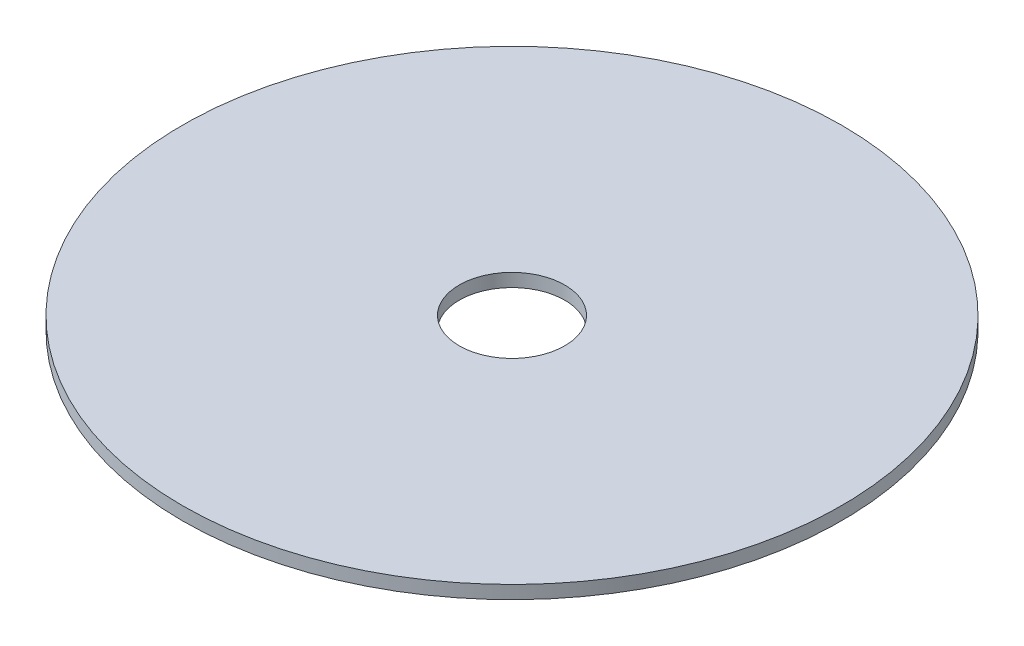
ISO-10303-21;
HEADER;
FILE_DESCRIPTION(('STEP AP214'),'2;1');
FILE_NAME('part.step','',(''),(''),'','','');
FILE_SCHEMA(('AUTOMOTIVE_DESIGN { 1 0 10303 214 1 1 1 1 }'));
ENDSEC;
DATA;
#1=APPLICATION_CONTEXT('core data for automotive mechanical design processes');
#2=APPLICATION_PROTOCOL_DEFINITION('international standard','automotive_design',2000,#1);
#3=PRODUCT_CONTEXT('',#1,'mechanical');
#4=PRODUCT('Part','Part','',(#3));
#5=PRODUCT_RELATED_PRODUCT_CATEGORY('part','',(#4));
#6=PRODUCT_DEFINITION_FORMATION('','',#4);
#7=PRODUCT_DEFINITION_CONTEXT('part definition',#1,'design');
#8=PRODUCT_DEFINITION('design','',#6,#7);
#9=PRODUCT_DEFINITION_SHAPE('','',#8);
#10=(LENGTH_UNIT() NAMED_UNIT(*) SI_UNIT(.MILLI.,.METRE.));
#11=(NAMED_UNIT(*) PLANE_ANGLE_UNIT() SI_UNIT($,.RADIAN.));
#12=(NAMED_UNIT(*) SI_UNIT($,.STERADIAN.) SOLID_ANGLE_UNIT());
#13=UNCERTAINTY_MEASURE_WITH_UNIT(LENGTH_MEASURE(1.E-05),#10,'distance_accuracy_value','');
#14=(GEOMETRIC_REPRESENTATION_CONTEXT(3) GLOBAL_UNCERTAINTY_ASSIGNED_CONTEXT((#13)) GLOBAL_UNIT_ASSIGNED_CONTEXT((#10,
#11,#12)) REPRESENTATION_CONTEXT('',''));
#15=CARTESIAN_POINT('',(0.,0.,0.));
#16=DIRECTION('',(0.,0.,1.));
#17=DIRECTION('',(1.,0.,0.));
#18=AXIS2_PLACEMENT_3D('',#15,#16,#17);
#19=CARTESIAN_POINT('',(0.,1.5,0.));
#20=DIRECTION('',(0.,1.,0.));
#21=DIRECTION('',(0.,0.,1.));
#22=AXIS2_PLACEMENT_3D('',#19,#20,#21);
#23=PLANE('',#22);
#24=CARTESIAN_POINT('',(0.,1.5,0.));
#25=DIRECTION('',(0.,1.,0.));
#26=DIRECTION('',(0.,0.,1.));
#27=AXIS2_PLACEMENT_3D('',#24,#25,#26);
#28=CIRCLE('',#27,37.5);
#29=CARTESIAN_POINT('',(0.,1.5,37.5));
#30=VERTEX_POINT('',#29);
#31=EDGE_CURVE('E10',#30,#30,#28,.T.);
#32=ORIENTED_EDGE('',*,*,#31,.T.);
#33=EDGE_LOOP('',(#32));
#34=FACE_BOUND('',#33,.T.);
#35=CARTESIAN_POINT('',(0.,1.5,0.));
#36=DIRECTION('',(0.,1.,0.));
#37=DIRECTION('',(0.,0.,1.));
#38=AXIS2_PLACEMENT_3D('',#35,#36,#37);
#39=CIRCLE('',#38,6.);
#40=CARTESIAN_POINT('',(0.,1.5,6.));
#41=VERTEX_POINT('',#40);
#42=EDGE_CURVE('E55',#41,#41,#39,.T.);
#43=ORIENTED_EDGE('',*,*,#42,.F.);
#44=EDGE_LOOP('',(#43));
#45=FACE_BOUND('',#44,.T.);
#46=ADVANCED_FACE('F41',(#34,#45),#23,.T.);
#47=CARTESIAN_POINT('',(0.,0.,0.));
#48=DIRECTION('',(0.,1.,0.));
#49=DIRECTION('',(0.,0.,1.));
#50=AXIS2_PLACEMENT_3D('',#47,#48,#49);
#51=PLANE('',#50);
#52=CARTESIAN_POINT('',(0.,0.,0.));
#53=DIRECTION('',(0.,1.,0.));
#54=DIRECTION('',(0.,0.,1.));
#55=AXIS2_PLACEMENT_3D('',#52,#53,#54);
#56=CIRCLE('',#55,37.5);
#57=CARTESIAN_POINT('',(0.,0.,37.5));
#58=VERTEX_POINT('',#57);
#59=EDGE_CURVE('E45',#58,#58,#56,.T.);
#60=ORIENTED_EDGE('',*,*,#59,.F.);
#61=EDGE_LOOP('',(#60));
#62=FACE_BOUND('',#61,.T.);
#63=CARTESIAN_POINT('',(0.,0.,0.));
#64=DIRECTION('',(0.,1.,0.));
#65=DIRECTION('',(0.,0.,1.));
#66=AXIS2_PLACEMENT_3D('',#63,#64,#65);
#67=CIRCLE('',#66,6.);
#68=CARTESIAN_POINT('',(0.,0.,6.));
#69=VERTEX_POINT('',#68);
#70=EDGE_CURVE('E57',#69,#69,#67,.T.);
#71=ORIENTED_EDGE('',*,*,#70,.T.);
#72=EDGE_LOOP('',(#71));
#73=FACE_BOUND('',#72,.T.);
#74=ADVANCED_FACE('F70',(#62,#73),#51,.F.);
#75=CARTESIAN_POINT('',(0.,1.5,0.));
#76=DIRECTION('',(0.,-1.,0.));
#77=DIRECTION('',(0.,0.,-1.));
#78=AXIS2_PLACEMENT_3D('',#75,#76,#77);
#79=CYLINDRICAL_SURFACE('',#78,37.5);
#80=ORIENTED_EDGE('',*,*,#31,.F.);
#81=EDGE_LOOP('',(#80));
#82=FACE_BOUND('',#81,.T.);
#83=ORIENTED_EDGE('',*,*,#59,.T.);
#84=EDGE_LOOP('',(#83));
#85=FACE_BOUND('',#84,.T.);
#86=ADVANCED_FACE('F43',(#82,#85),#79,.T.);
#87=CARTESIAN_POINT('',(0.,1.5,0.));
#88=DIRECTION('',(0.,-1.,0.));
#89=DIRECTION('',(0.,0.,-1.));
#90=AXIS2_PLACEMENT_3D('',#87,#88,#89);
#91=CYLINDRICAL_SURFACE('',#90,6.);
#92=ORIENTED_EDGE('',*,*,#42,.T.);
#93=EDGE_LOOP('',(#92));
#94=FACE_BOUND('',#93,.T.);
#95=ORIENTED_EDGE('',*,*,#70,.F.);
#96=EDGE_LOOP('',(#95));
#97=FACE_BOUND('',#96,.T.);
#98=ADVANCED_FACE('F66',(#94,#97),#91,.F.);
#99=CLOSED_SHELL('',(#46,#74,#86,#98));
#100=MANIFOLD_SOLID_BREP('B2',#99);
#101=ADVANCED_BREP_SHAPE_REPRESENTATION('',(#18,#100),#14);
#102=SHAPE_DEFINITION_REPRESENTATION(#9,#101);
ENDSEC;
END-ISO-10303-21;
